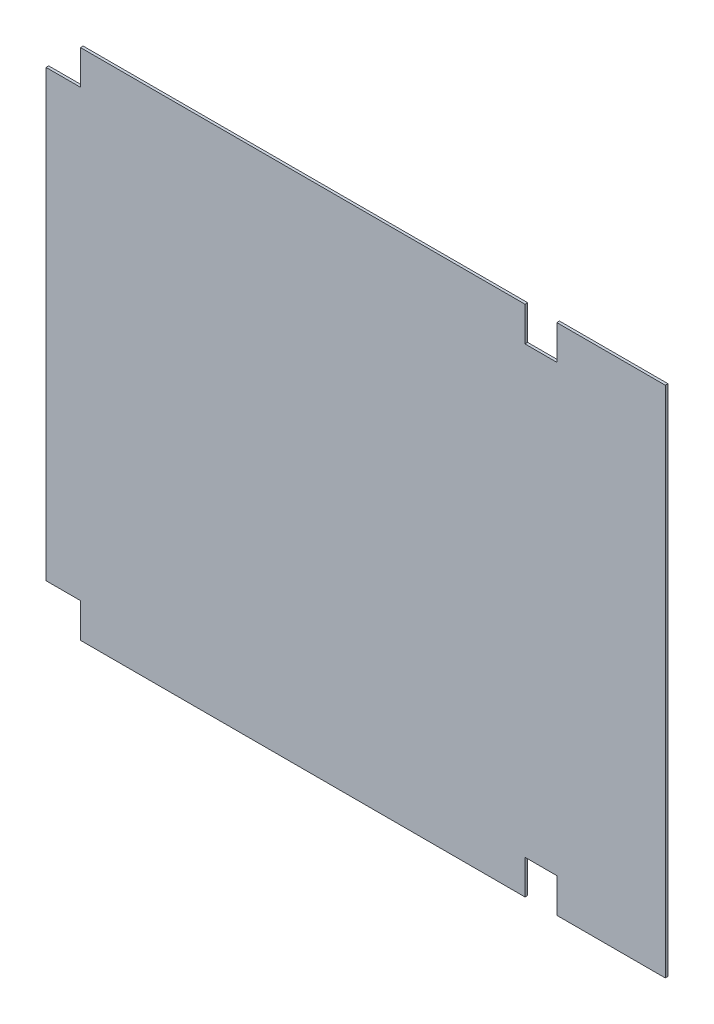
ISO-10303-21;
HEADER;
FILE_DESCRIPTION(('STEP AP214'),'2;1');
FILE_NAME('part.step','',(''),(''),'','','');
FILE_SCHEMA(('AUTOMOTIVE_DESIGN { 1 0 10303 214 1 1 1 1 }'));
ENDSEC;
DATA;
#1=APPLICATION_CONTEXT('core data for automotive mechanical design processes');
#2=APPLICATION_PROTOCOL_DEFINITION('international standard','automotive_design',2000,#1);
#3=PRODUCT_CONTEXT('',#1,'mechanical');
#4=PRODUCT('Part','Part','',(#3));
#5=PRODUCT_RELATED_PRODUCT_CATEGORY('part','',(#4));
#6=PRODUCT_DEFINITION_FORMATION('','',#4);
#7=PRODUCT_DEFINITION_CONTEXT('part definition',#1,'design');
#8=PRODUCT_DEFINITION('design','',#6,#7);
#9=PRODUCT_DEFINITION_SHAPE('','',#8);
#10=(LENGTH_UNIT() NAMED_UNIT(*) SI_UNIT(.MILLI.,.METRE.));
#11=(NAMED_UNIT(*) PLANE_ANGLE_UNIT() SI_UNIT($,.RADIAN.));
#12=(NAMED_UNIT(*) SI_UNIT($,.STERADIAN.) SOLID_ANGLE_UNIT());
#13=UNCERTAINTY_MEASURE_WITH_UNIT(LENGTH_MEASURE(1.E-05),#10,'distance_accuracy_value','');
#14=(GEOMETRIC_REPRESENTATION_CONTEXT(3) GLOBAL_UNCERTAINTY_ASSIGNED_CONTEXT((#13)) GLOBAL_UNIT_ASSIGNED_CONTEXT((#10,
#11,#12)) REPRESENTATION_CONTEXT('',''));
#15=CARTESIAN_POINT('',(0.,0.,0.));
#16=DIRECTION('',(0.,0.,1.));
#17=DIRECTION('',(1.,0.,0.));
#18=AXIS2_PLACEMENT_3D('',#15,#16,#17);
#19=CARTESIAN_POINT('',(-371.475,307.975,3.175));
#20=DIRECTION('',(0.,-1.,0.));
#21=DIRECTION('',(0.,0.,-1.));
#22=AXIS2_PLACEMENT_3D('',#19,#20,#21);
#23=PLANE('',#22);
#24=DIRECTION('',(-1.,0.,0.));
#25=VECTOR('',#24,1.);
#26=CARTESIAN_POINT('',(-371.475,307.975,3.175));
#27=LINE('',#26,#25);
#28=CARTESIAN_POINT('',(203.2,307.975,3.175));
#29=VERTEX_POINT('',#28);
#30=CARTESIAN_POINT('',(-330.2,307.975,3.175));
#31=VERTEX_POINT('',#30);
#32=EDGE_CURVE('E250',#29,#31,#27,.T.);
#33=ORIENTED_EDGE('',*,*,#32,.F.);
#34=DIRECTION('',(0.,0.,1.));
#35=VECTOR('',#34,1.);
#36=CARTESIAN_POINT('',(203.2,307.975,0.));
#37=LINE('',#36,#35);
#38=CARTESIAN_POINT('',(203.2,307.975,0.));
#39=VERTEX_POINT('',#38);
#40=EDGE_CURVE('E178',#39,#29,#37,.T.);
#41=ORIENTED_EDGE('',*,*,#40,.F.);
#42=DIRECTION('',(-1.,0.,0.));
#43=VECTOR('',#42,1.);
#44=CARTESIAN_POINT('',(-371.475,307.975,0.));
#45=LINE('',#44,#43);
#46=CARTESIAN_POINT('',(-330.2,307.975,0.));
#47=VERTEX_POINT('',#46);
#48=EDGE_CURVE('E261',#39,#47,#45,.T.);
#49=ORIENTED_EDGE('',*,*,#48,.T.);
#50=DIRECTION('',(0.,0.,1.));
#51=VECTOR('',#50,1.);
#52=CARTESIAN_POINT('',(-330.2,307.975,0.));
#53=LINE('',#52,#51);
#54=EDGE_CURVE('E240',#47,#31,#53,.T.);
#55=ORIENTED_EDGE('',*,*,#54,.T.);
#56=EDGE_LOOP('',(#33,#41,#49,#55));
#57=FACE_BOUND('',#56,.T.);
#58=ADVANCED_FACE('F39',(#57),#23,.F.);
#59=CARTESIAN_POINT('',(-371.475,-307.975,3.175));
#60=DIRECTION('',(0.,1.,0.));
#61=DIRECTION('',(0.,0.,1.));
#62=AXIS2_PLACEMENT_3D('',#59,#60,#61);
#63=PLANE('',#62);
#64=DIRECTION('',(1.,0.,0.));
#65=VECTOR('',#64,1.);
#66=CARTESIAN_POINT('',(-371.475,-307.975,3.175));
#67=LINE('',#66,#65);
#68=CARTESIAN_POINT('',(-330.2,-307.975,3.175));
#69=VERTEX_POINT('',#68);
#70=CARTESIAN_POINT('',(203.2,-307.975,3.175));
#71=VERTEX_POINT('',#70);
#72=EDGE_CURVE('E177',#69,#71,#67,.T.);
#73=ORIENTED_EDGE('',*,*,#72,.F.);
#74=DIRECTION('',(0.,0.,1.));
#75=VECTOR('',#74,1.);
#76=CARTESIAN_POINT('',(-330.2,-307.975,0.));
#77=LINE('',#76,#75);
#78=CARTESIAN_POINT('',(-330.2,-307.975,0.));
#79=VERTEX_POINT('',#78);
#80=EDGE_CURVE('E191',#79,#69,#77,.T.);
#81=ORIENTED_EDGE('',*,*,#80,.F.);
#82=DIRECTION('',(1.,0.,0.));
#83=VECTOR('',#82,1.);
#84=CARTESIAN_POINT('',(-371.475,-307.975,0.));
#85=LINE('',#84,#83);
#86=CARTESIAN_POINT('',(203.2,-307.975,0.));
#87=VERTEX_POINT('',#86);
#88=EDGE_CURVE('E251',#79,#87,#85,.T.);
#89=ORIENTED_EDGE('',*,*,#88,.T.);
#90=DIRECTION('',(0.,0.,1.));
#91=VECTOR('',#90,1.);
#92=CARTESIAN_POINT('',(203.2,-307.975,0.));
#93=LINE('',#92,#91);
#94=EDGE_CURVE('E187',#87,#71,#93,.T.);
#95=ORIENTED_EDGE('',*,*,#94,.T.);
#96=EDGE_LOOP('',(#73,#81,#89,#95));
#97=FACE_BOUND('',#96,.T.);
#98=ADVANCED_FACE('F292',(#97),#63,.F.);
#99=CARTESIAN_POINT('',(371.475,-307.975,3.175));
#100=DIRECTION('',(-1.,0.,0.));
#101=DIRECTION('',(0.,0.,1.));
#102=AXIS2_PLACEMENT_3D('',#99,#100,#101);
#103=PLANE('',#102);
#104=DIRECTION('',(0.,1.,0.));
#105=VECTOR('',#104,1.);
#106=CARTESIAN_POINT('',(371.475,-307.975,0.));
#107=LINE('',#106,#105);
#108=CARTESIAN_POINT('',(371.475,-307.975,0.));
#109=VERTEX_POINT('',#108);
#110=CARTESIAN_POINT('',(371.475,307.975,0.));
#111=VERTEX_POINT('',#110);
#112=EDGE_CURVE('E243',#109,#111,#107,.T.);
#113=ORIENTED_EDGE('',*,*,#112,.T.);
#114=DIRECTION('',(0.,0.,-1.));
#115=VECTOR('',#114,1.);
#116=CARTESIAN_POINT('',(371.475,307.975,3.175));
#117=LINE('',#116,#115);
#118=CARTESIAN_POINT('',(371.475,307.975,3.175));
#119=VERTEX_POINT('',#118);
#120=EDGE_CURVE('E11',#119,#111,#117,.T.);
#121=ORIENTED_EDGE('',*,*,#120,.F.);
#122=DIRECTION('',(0.,1.,0.));
#123=VECTOR('',#122,1.);
#124=CARTESIAN_POINT('',(371.475,-307.975,3.175));
#125=LINE('',#124,#123);
#126=CARTESIAN_POINT('',(371.475,-307.975,3.175));
#127=VERTEX_POINT('',#126);
#128=EDGE_CURVE('E247',#127,#119,#125,.T.);
#129=ORIENTED_EDGE('',*,*,#128,.F.);
#130=DIRECTION('',(0.,0.,-1.));
#131=VECTOR('',#130,1.);
#132=CARTESIAN_POINT('',(371.475,-307.975,3.175));
#133=LINE('',#132,#131);
#134=EDGE_CURVE('E47',#127,#109,#133,.T.);
#135=ORIENTED_EDGE('',*,*,#134,.T.);
#136=EDGE_LOOP('',(#113,#121,#129,#135));
#137=FACE_BOUND('',#136,.T.);
#138=ADVANCED_FACE('F41',(#137),#103,.F.);
#139=CARTESIAN_POINT('',(241.3,307.975,0.));
#140=VERTEX_POINT('',#139);
#141=EDGE_CURVE('E262',#111,#140,#45,.T.);
#142=ORIENTED_EDGE('',*,*,#141,.T.);
#143=DIRECTION('',(0.,0.,1.));
#144=VECTOR('',#143,1.);
#145=CARTESIAN_POINT('',(241.3,307.975,0.));
#146=LINE('',#145,#144);
#147=CARTESIAN_POINT('',(241.3,307.975,3.175));
#148=VERTEX_POINT('',#147);
#149=EDGE_CURVE('E180',#140,#148,#146,.T.);
#150=ORIENTED_EDGE('',*,*,#149,.T.);
#151=EDGE_CURVE('E252',#119,#148,#27,.T.);
#152=ORIENTED_EDGE('',*,*,#151,.F.);
#153=ORIENTED_EDGE('',*,*,#120,.T.);
#154=EDGE_LOOP('',(#142,#150,#152,#153));
#155=FACE_BOUND('',#154,.T.);
#156=ADVANCED_FACE('F281',(#155),#23,.F.);
#157=CARTESIAN_POINT('',(-371.475,-307.975,3.175));
#158=DIRECTION('',(1.,0.,0.));
#159=DIRECTION('',(0.,0.,-1.));
#160=AXIS2_PLACEMENT_3D('',#157,#158,#159);
#161=PLANE('',#160);
#162=DIRECTION('',(0.,-1.,0.));
#163=VECTOR('',#162,1.);
#164=CARTESIAN_POINT('',(-371.475,-307.975,0.));
#165=LINE('',#164,#163);
#166=CARTESIAN_POINT('',(-371.475,266.7,0.));
#167=VERTEX_POINT('',#166);
#168=CARTESIAN_POINT('',(-371.475,-266.7,0.));
#169=VERTEX_POINT('',#168);
#170=EDGE_CURVE('E265',#167,#169,#165,.T.);
#171=ORIENTED_EDGE('',*,*,#170,.T.);
#172=DIRECTION('',(0.,0.,1.));
#173=VECTOR('',#172,1.);
#174=CARTESIAN_POINT('',(-371.475,-266.7,0.));
#175=LINE('',#174,#173);
#176=CARTESIAN_POINT('',(-371.475,-266.7,3.175));
#177=VERTEX_POINT('',#176);
#178=EDGE_CURVE('E195',#169,#177,#175,.T.);
#179=ORIENTED_EDGE('',*,*,#178,.T.);
#180=DIRECTION('',(0.,-1.,0.));
#181=VECTOR('',#180,1.);
#182=CARTESIAN_POINT('',(-371.475,-307.975,3.175));
#183=LINE('',#182,#181);
#184=CARTESIAN_POINT('',(-371.475,266.7,3.175));
#185=VERTEX_POINT('',#184);
#186=EDGE_CURVE('E255',#185,#177,#183,.T.);
#187=ORIENTED_EDGE('',*,*,#186,.F.);
#188=DIRECTION('',(0.,0.,1.));
#189=VECTOR('',#188,1.);
#190=CARTESIAN_POINT('',(-371.475,266.7,0.));
#191=LINE('',#190,#189);
#192=EDGE_CURVE('E236',#167,#185,#191,.T.);
#193=ORIENTED_EDGE('',*,*,#192,.F.);
#194=EDGE_LOOP('',(#171,#179,#187,#193));
#195=FACE_BOUND('',#194,.T.);
#196=ADVANCED_FACE('F318',(#195),#161,.F.);
#197=CARTESIAN_POINT('',(241.3,-307.975,3.175));
#198=VERTEX_POINT('',#197);
#199=EDGE_CURVE('E257',#198,#127,#67,.T.);
#200=ORIENTED_EDGE('',*,*,#199,.F.);
#201=DIRECTION('',(0.,0.,1.));
#202=VECTOR('',#201,1.);
#203=CARTESIAN_POINT('',(241.3,-307.975,0.));
#204=LINE('',#203,#202);
#205=CARTESIAN_POINT('',(241.3,-307.975,0.));
#206=VERTEX_POINT('',#205);
#207=EDGE_CURVE('E285',#206,#198,#204,.T.);
#208=ORIENTED_EDGE('',*,*,#207,.F.);
#209=EDGE_CURVE('E268',#206,#109,#85,.T.);
#210=ORIENTED_EDGE('',*,*,#209,.T.);
#211=ORIENTED_EDGE('',*,*,#134,.F.);
#212=EDGE_LOOP('',(#200,#208,#210,#211));
#213=FACE_BOUND('',#212,.T.);
#214=ADVANCED_FACE('F284',(#213),#63,.F.);
#215=CARTESIAN_POINT('',(0.,0.,3.175));
#216=DIRECTION('',(0.,0.,-1.));
#217=DIRECTION('',(-1.,0.,0.));
#218=AXIS2_PLACEMENT_3D('',#215,#216,#217);
#219=PLANE('',#218);
#220=ORIENTED_EDGE('',*,*,#186,.T.);
#221=DIRECTION('',(-1.,0.,0.));
#222=VECTOR('',#221,1.);
#223=CARTESIAN_POINT('',(-371.475,-266.7,3.175));
#224=LINE('',#223,#222);
#225=CARTESIAN_POINT('',(-330.2,-266.7,3.175));
#226=VERTEX_POINT('',#225);
#227=EDGE_CURVE('E199',#226,#177,#224,.T.);
#228=ORIENTED_EDGE('',*,*,#227,.F.);
#229=DIRECTION('',(0.,1.,0.));
#230=VECTOR('',#229,1.);
#231=CARTESIAN_POINT('',(-330.2,-307.975,3.175));
#232=LINE('',#231,#230);
#233=EDGE_CURVE('E201',#69,#226,#232,.T.);
#234=ORIENTED_EDGE('',*,*,#233,.F.);
#235=ORIENTED_EDGE('',*,*,#72,.T.);
#236=DIRECTION('',(0.,-1.,0.));
#237=VECTOR('',#236,1.);
#238=CARTESIAN_POINT('',(203.2,-307.975,3.175));
#239=LINE('',#238,#237);
#240=CARTESIAN_POINT('',(203.2,-266.7,3.175));
#241=VERTEX_POINT('',#240);
#242=EDGE_CURVE('E155',#241,#71,#239,.T.);
#243=ORIENTED_EDGE('',*,*,#242,.F.);
#244=DIRECTION('',(-1.,0.,0.));
#245=VECTOR('',#244,1.);
#246=CARTESIAN_POINT('',(203.2,-266.7,3.175));
#247=LINE('',#246,#245);
#248=CARTESIAN_POINT('',(241.3,-266.7,3.175));
#249=VERTEX_POINT('',#248);
#250=EDGE_CURVE('E164',#249,#241,#247,.T.);
#251=ORIENTED_EDGE('',*,*,#250,.F.);
#252=DIRECTION('',(0.,1.,0.));
#253=VECTOR('',#252,1.);
#254=CARTESIAN_POINT('',(241.3,-307.975,3.175));
#255=LINE('',#254,#253);
#256=EDGE_CURVE('E170',#198,#249,#255,.T.);
#257=ORIENTED_EDGE('',*,*,#256,.F.);
#258=ORIENTED_EDGE('',*,*,#199,.T.);
#259=ORIENTED_EDGE('',*,*,#128,.T.);
#260=ORIENTED_EDGE('',*,*,#151,.T.);
#261=DIRECTION('',(0.,1.,0.));
#262=VECTOR('',#261,1.);
#263=CARTESIAN_POINT('',(241.3,307.975,3.175));
#264=LINE('',#263,#262);
#265=CARTESIAN_POINT('',(241.3,266.7,3.175));
#266=VERTEX_POINT('',#265);
#267=EDGE_CURVE('E215',#266,#148,#264,.T.);
#268=ORIENTED_EDGE('',*,*,#267,.F.);
#269=DIRECTION('',(1.,0.,0.));
#270=VECTOR('',#269,1.);
#271=CARTESIAN_POINT('',(203.2,266.7,3.175));
#272=LINE('',#271,#270);
#273=CARTESIAN_POINT('',(203.2,266.7,3.175));
#274=VERTEX_POINT('',#273);
#275=EDGE_CURVE('E217',#274,#266,#272,.T.);
#276=ORIENTED_EDGE('',*,*,#275,.F.);
#277=DIRECTION('',(0.,-1.,0.));
#278=VECTOR('',#277,1.);
#279=CARTESIAN_POINT('',(203.2,307.975,3.175));
#280=LINE('',#279,#278);
#281=EDGE_CURVE('E198',#29,#274,#280,.T.);
#282=ORIENTED_EDGE('',*,*,#281,.F.);
#283=ORIENTED_EDGE('',*,*,#32,.T.);
#284=DIRECTION('',(0.,1.,0.));
#285=VECTOR('',#284,1.);
#286=CARTESIAN_POINT('',(-330.2,307.975,3.175));
#287=LINE('',#286,#285);
#288=CARTESIAN_POINT('',(-330.2,266.7,3.175));
#289=VERTEX_POINT('',#288);
#290=EDGE_CURVE('E233',#289,#31,#287,.T.);
#291=ORIENTED_EDGE('',*,*,#290,.F.);
#292=DIRECTION('',(1.,0.,0.));
#293=VECTOR('',#292,1.);
#294=CARTESIAN_POINT('',(-371.475,266.7,3.175));
#295=LINE('',#294,#293);
#296=EDGE_CURVE('E205',#185,#289,#295,.T.);
#297=ORIENTED_EDGE('',*,*,#296,.F.);
#298=EDGE_LOOP('',(#220,#228,#234,#235,#243,#251,#257,#258,#259,#260,#268,#276,#282,#283,#291,#297));
#299=FACE_BOUND('',#298,.T.);
#300=ADVANCED_FACE('F174',(#299),#219,.F.);
#301=CARTESIAN_POINT('',(0.,0.,0.));
#302=DIRECTION('',(0.,0.,-1.));
#303=DIRECTION('',(-1.,0.,0.));
#304=AXIS2_PLACEMENT_3D('',#301,#302,#303);
#305=PLANE('',#304);
#306=DIRECTION('',(-1.,0.,0.));
#307=VECTOR('',#306,1.);
#308=CARTESIAN_POINT('',(-371.475,-266.7,0.));
#309=LINE('',#308,#307);
#310=CARTESIAN_POINT('',(-330.2,-266.7,0.));
#311=VERTEX_POINT('',#310);
#312=EDGE_CURVE('E54',#311,#169,#309,.T.);
#313=ORIENTED_EDGE('',*,*,#312,.T.);
#314=ORIENTED_EDGE('',*,*,#170,.F.);
#315=DIRECTION('',(1.,0.,0.));
#316=VECTOR('',#315,1.);
#317=CARTESIAN_POINT('',(-371.475,266.7,0.));
#318=LINE('',#317,#316);
#319=CARTESIAN_POINT('',(-330.2,266.7,0.));
#320=VERTEX_POINT('',#319);
#321=EDGE_CURVE('E229',#167,#320,#318,.T.);
#322=ORIENTED_EDGE('',*,*,#321,.T.);
#323=DIRECTION('',(0.,1.,0.));
#324=VECTOR('',#323,1.);
#325=CARTESIAN_POINT('',(-330.2,307.975,0.));
#326=LINE('',#325,#324);
#327=EDGE_CURVE('E232',#320,#47,#326,.T.);
#328=ORIENTED_EDGE('',*,*,#327,.T.);
#329=ORIENTED_EDGE('',*,*,#48,.F.);
#330=DIRECTION('',(0.,-1.,0.));
#331=VECTOR('',#330,1.);
#332=CARTESIAN_POINT('',(203.2,307.975,0.));
#333=LINE('',#332,#331);
#334=CARTESIAN_POINT('',(203.2,266.7,0.));
#335=VERTEX_POINT('',#334);
#336=EDGE_CURVE('E218',#39,#335,#333,.T.);
#337=ORIENTED_EDGE('',*,*,#336,.T.);
#338=DIRECTION('',(1.,0.,0.));
#339=VECTOR('',#338,1.);
#340=CARTESIAN_POINT('',(203.2,266.7,0.));
#341=LINE('',#340,#339);
#342=CARTESIAN_POINT('',(241.3,266.7,0.));
#343=VERTEX_POINT('',#342);
#344=EDGE_CURVE('E224',#335,#343,#341,.T.);
#345=ORIENTED_EDGE('',*,*,#344,.T.);
#346=DIRECTION('',(0.,1.,0.));
#347=VECTOR('',#346,1.);
#348=CARTESIAN_POINT('',(241.3,307.975,0.));
#349=LINE('',#348,#347);
#350=EDGE_CURVE('E62',#343,#140,#349,.T.);
#351=ORIENTED_EDGE('',*,*,#350,.T.);
#352=ORIENTED_EDGE('',*,*,#141,.F.);
#353=ORIENTED_EDGE('',*,*,#112,.F.);
#354=ORIENTED_EDGE('',*,*,#209,.F.);
#355=DIRECTION('',(0.,1.,0.));
#356=VECTOR('',#355,1.);
#357=CARTESIAN_POINT('',(241.3,-307.975,0.));
#358=LINE('',#357,#356);
#359=CARTESIAN_POINT('',(241.3,-266.7,0.));
#360=VERTEX_POINT('',#359);
#361=EDGE_CURVE('E186',#206,#360,#358,.T.);
#362=ORIENTED_EDGE('',*,*,#361,.T.);
#363=DIRECTION('',(-1.,0.,0.));
#364=VECTOR('',#363,1.);
#365=CARTESIAN_POINT('',(203.2,-266.7,0.));
#366=LINE('',#365,#364);
#367=CARTESIAN_POINT('',(203.2,-266.7,0.));
#368=VERTEX_POINT('',#367);
#369=EDGE_CURVE('E184',#360,#368,#366,.T.);
#370=ORIENTED_EDGE('',*,*,#369,.T.);
#371=DIRECTION('',(0.,-1.,0.));
#372=VECTOR('',#371,1.);
#373=CARTESIAN_POINT('',(203.2,-307.975,0.));
#374=LINE('',#373,#372);
#375=EDGE_CURVE('E158',#368,#87,#374,.T.);
#376=ORIENTED_EDGE('',*,*,#375,.T.);
#377=ORIENTED_EDGE('',*,*,#88,.F.);
#378=DIRECTION('',(0.,1.,0.));
#379=VECTOR('',#378,1.);
#380=CARTESIAN_POINT('',(-330.2,-307.975,0.));
#381=LINE('',#380,#379);
#382=EDGE_CURVE('E202',#79,#311,#381,.T.);
#383=ORIENTED_EDGE('',*,*,#382,.T.);
#384=EDGE_LOOP('',(#313,#314,#322,#328,#329,#337,#345,#351,#352,#353,#354,#362,#370,#376,#377,#383));
#385=FACE_BOUND('',#384,.T.);
#386=ADVANCED_FACE('F279',(#385),#305,.T.);
#387=CARTESIAN_POINT('',(-330.2,307.975,0.));
#388=DIRECTION('',(1.,0.,0.));
#389=DIRECTION('',(0.,0.,-1.));
#390=AXIS2_PLACEMENT_3D('',#387,#388,#389);
#391=PLANE('',#390);
#392=ORIENTED_EDGE('',*,*,#290,.T.);
#393=ORIENTED_EDGE('',*,*,#54,.F.);
#394=ORIENTED_EDGE('',*,*,#327,.F.);
#395=DIRECTION('',(0.,0.,1.));
#396=VECTOR('',#395,1.);
#397=CARTESIAN_POINT('',(-330.2,266.7,0.));
#398=LINE('',#397,#396);
#399=EDGE_CURVE('E244',#320,#289,#398,.T.);
#400=ORIENTED_EDGE('',*,*,#399,.T.);
#401=EDGE_LOOP('',(#392,#393,#394,#400));
#402=FACE_BOUND('',#401,.T.);
#403=ADVANCED_FACE('F360',(#402),#391,.F.);
#404=CARTESIAN_POINT('',(-371.475,266.7,0.));
#405=DIRECTION('',(0.,-1.,0.));
#406=DIRECTION('',(0.,0.,-1.));
#407=AXIS2_PLACEMENT_3D('',#404,#405,#406);
#408=PLANE('',#407);
#409=ORIENTED_EDGE('',*,*,#296,.T.);
#410=ORIENTED_EDGE('',*,*,#399,.F.);
#411=ORIENTED_EDGE('',*,*,#321,.F.);
#412=ORIENTED_EDGE('',*,*,#192,.T.);
#413=EDGE_LOOP('',(#409,#410,#411,#412));
#414=FACE_BOUND('',#413,.T.);
#415=ADVANCED_FACE('F378',(#414),#408,.F.);
#416=CARTESIAN_POINT('',(203.2,-307.975,0.));
#417=DIRECTION('',(-1.,0.,0.));
#418=DIRECTION('',(0.,-1.,0.));
#419=AXIS2_PLACEMENT_3D('',#416,#417,#418);
#420=PLANE('',#419);
#421=ORIENTED_EDGE('',*,*,#242,.T.);
#422=ORIENTED_EDGE('',*,*,#94,.F.);
#423=ORIENTED_EDGE('',*,*,#375,.F.);
#424=DIRECTION('',(0.,0.,1.));
#425=VECTOR('',#424,1.);
#426=CARTESIAN_POINT('',(203.2,-266.7,0.));
#427=LINE('',#426,#425);
#428=EDGE_CURVE('E151',#368,#241,#427,.T.);
#429=ORIENTED_EDGE('',*,*,#428,.T.);
#430=EDGE_LOOP('',(#421,#422,#423,#429));
#431=FACE_BOUND('',#430,.T.);
#432=ADVANCED_FACE('F153',(#431),#420,.F.);
#433=CARTESIAN_POINT('',(203.2,-266.7,0.));
#434=DIRECTION('',(0.,1.,0.));
#435=DIRECTION('',(0.,0.,1.));
#436=AXIS2_PLACEMENT_3D('',#433,#434,#435);
#437=PLANE('',#436);
#438=ORIENTED_EDGE('',*,*,#250,.T.);
#439=ORIENTED_EDGE('',*,*,#428,.F.);
#440=ORIENTED_EDGE('',*,*,#369,.F.);
#441=DIRECTION('',(0.,0.,1.));
#442=VECTOR('',#441,1.);
#443=CARTESIAN_POINT('',(241.3,-266.7,0.));
#444=LINE('',#443,#442);
#445=EDGE_CURVE('E161',#360,#249,#444,.T.);
#446=ORIENTED_EDGE('',*,*,#445,.T.);
#447=EDGE_LOOP('',(#438,#439,#440,#446));
#448=FACE_BOUND('',#447,.T.);
#449=ADVANCED_FACE('F165',(#448),#437,.F.);
#450=CARTESIAN_POINT('',(241.3,-307.975,0.));
#451=DIRECTION('',(1.,0.,0.));
#452=DIRECTION('',(0.,0.,-1.));
#453=AXIS2_PLACEMENT_3D('',#450,#451,#452);
#454=PLANE('',#453);
#455=ORIENTED_EDGE('',*,*,#256,.T.);
#456=ORIENTED_EDGE('',*,*,#445,.F.);
#457=ORIENTED_EDGE('',*,*,#361,.F.);
#458=ORIENTED_EDGE('',*,*,#207,.T.);
#459=EDGE_LOOP('',(#455,#456,#457,#458));
#460=FACE_BOUND('',#459,.T.);
#461=ADVANCED_FACE('F295',(#460),#454,.F.);
#462=CARTESIAN_POINT('',(203.2,307.975,0.));
#463=DIRECTION('',(-1.,0.,0.));
#464=DIRECTION('',(0.,0.,1.));
#465=AXIS2_PLACEMENT_3D('',#462,#463,#464);
#466=PLANE('',#465);
#467=ORIENTED_EDGE('',*,*,#281,.T.);
#468=DIRECTION('',(0.,0.,1.));
#469=VECTOR('',#468,1.);
#470=CARTESIAN_POINT('',(203.2,266.7,0.));
#471=LINE('',#470,#469);
#472=EDGE_CURVE('E209',#335,#274,#471,.T.);
#473=ORIENTED_EDGE('',*,*,#472,.F.);
#474=ORIENTED_EDGE('',*,*,#336,.F.);
#475=ORIENTED_EDGE('',*,*,#40,.T.);
#476=EDGE_LOOP('',(#467,#473,#474,#475));
#477=FACE_BOUND('',#476,.T.);
#478=ADVANCED_FACE('F297',(#477),#466,.F.);
#479=CARTESIAN_POINT('',(241.3,307.975,0.));
#480=DIRECTION('',(1.,0.,0.));
#481=DIRECTION('',(0.,0.,-1.));
#482=AXIS2_PLACEMENT_3D('',#479,#480,#481);
#483=PLANE('',#482);
#484=ORIENTED_EDGE('',*,*,#267,.T.);
#485=ORIENTED_EDGE('',*,*,#149,.F.);
#486=ORIENTED_EDGE('',*,*,#350,.F.);
#487=DIRECTION('',(0.,0.,1.));
#488=VECTOR('',#487,1.);
#489=CARTESIAN_POINT('',(241.3,266.7,0.));
#490=LINE('',#489,#488);
#491=EDGE_CURVE('E211',#343,#266,#490,.T.);
#492=ORIENTED_EDGE('',*,*,#491,.T.);
#493=EDGE_LOOP('',(#484,#485,#486,#492));
#494=FACE_BOUND('',#493,.T.);
#495=ADVANCED_FACE('F303',(#494),#483,.F.);
#496=CARTESIAN_POINT('',(203.2,266.7,0.));
#497=DIRECTION('',(0.,-1.,0.));
#498=DIRECTION('',(0.,0.,-1.));
#499=AXIS2_PLACEMENT_3D('',#496,#497,#498);
#500=PLANE('',#499);
#501=ORIENTED_EDGE('',*,*,#275,.T.);
#502=ORIENTED_EDGE('',*,*,#491,.F.);
#503=ORIENTED_EDGE('',*,*,#344,.F.);
#504=ORIENTED_EDGE('',*,*,#472,.T.);
#505=EDGE_LOOP('',(#501,#502,#503,#504));
#506=FACE_BOUND('',#505,.T.);
#507=ADVANCED_FACE('F420',(#506),#500,.F.);
#508=CARTESIAN_POINT('',(-371.475,-266.7,0.));
#509=DIRECTION('',(0.,1.,0.));
#510=DIRECTION('',(0.,0.,1.));
#511=AXIS2_PLACEMENT_3D('',#508,#509,#510);
#512=PLANE('',#511);
#513=ORIENTED_EDGE('',*,*,#227,.T.);
#514=ORIENTED_EDGE('',*,*,#178,.F.);
#515=ORIENTED_EDGE('',*,*,#312,.F.);
#516=DIRECTION('',(0.,0.,1.));
#517=VECTOR('',#516,1.);
#518=CARTESIAN_POINT('',(-330.2,-266.7,0.));
#519=LINE('',#518,#517);
#520=EDGE_CURVE('E193',#311,#226,#519,.T.);
#521=ORIENTED_EDGE('',*,*,#520,.T.);
#522=EDGE_LOOP('',(#513,#514,#515,#521));
#523=FACE_BOUND('',#522,.T.);
#524=ADVANCED_FACE('F429',(#523),#512,.F.);
#525=CARTESIAN_POINT('',(-330.2,-307.975,0.));
#526=DIRECTION('',(1.,0.,0.));
#527=DIRECTION('',(0.,1.,0.));
#528=AXIS2_PLACEMENT_3D('',#525,#526,#527);
#529=PLANE('',#528);
#530=ORIENTED_EDGE('',*,*,#233,.T.);
#531=ORIENTED_EDGE('',*,*,#520,.F.);
#532=ORIENTED_EDGE('',*,*,#382,.F.);
#533=ORIENTED_EDGE('',*,*,#80,.T.);
#534=EDGE_LOOP('',(#530,#531,#532,#533));
#535=FACE_BOUND('',#534,.T.);
#536=ADVANCED_FACE('F439',(#535),#529,.F.);
#537=CLOSED_SHELL('',(#58,#98,#138,#156,#196,#214,#300,#386,#403,#415,#432,#449,#461,#478,#495,
#507,#524,#536));
#538=MANIFOLD_SOLID_BREP('B2',#537);
#539=ADVANCED_BREP_SHAPE_REPRESENTATION('',(#18,#538),#14);
#540=SHAPE_DEFINITION_REPRESENTATION(#9,#539);
ENDSEC;
END-ISO-10303-21;
